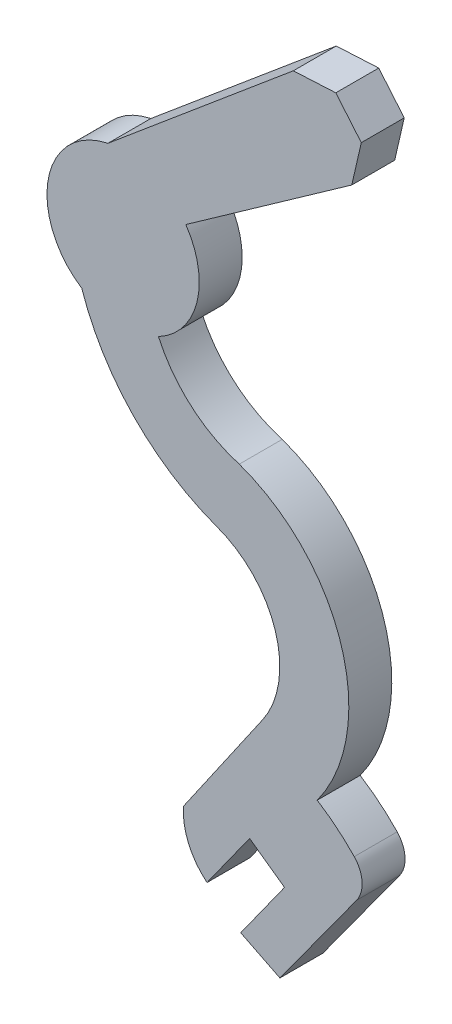
ISO-10303-21;
HEADER;
FILE_DESCRIPTION(('STEP AP214'),'2;1');
FILE_NAME('part.step','',(''),(''),'','','');
FILE_SCHEMA(('AUTOMOTIVE_DESIGN { 1 0 10303 214 1 1 1 1 }'));
ENDSEC;
DATA;
#1=APPLICATION_CONTEXT('core data for automotive mechanical design processes');
#2=APPLICATION_PROTOCOL_DEFINITION('international standard','automotive_design',2000,#1);
#3=PRODUCT_CONTEXT('',#1,'mechanical');
#4=PRODUCT('Part','Part','',(#3));
#5=PRODUCT_RELATED_PRODUCT_CATEGORY('part','',(#4));
#6=PRODUCT_DEFINITION_FORMATION('','',#4);
#7=PRODUCT_DEFINITION_CONTEXT('part definition',#1,'design');
#8=PRODUCT_DEFINITION('design','',#6,#7);
#9=PRODUCT_DEFINITION_SHAPE('','',#8);
#10=(LENGTH_UNIT() NAMED_UNIT(*) SI_UNIT(.MILLI.,.METRE.));
#11=(NAMED_UNIT(*) PLANE_ANGLE_UNIT() SI_UNIT($,.RADIAN.));
#12=(NAMED_UNIT(*) SI_UNIT($,.STERADIAN.) SOLID_ANGLE_UNIT());
#13=UNCERTAINTY_MEASURE_WITH_UNIT(LENGTH_MEASURE(1.E-05),#10,'distance_accuracy_value','');
#14=(GEOMETRIC_REPRESENTATION_CONTEXT(3) GLOBAL_UNCERTAINTY_ASSIGNED_CONTEXT((#13)) GLOBAL_UNIT_ASSIGNED_CONTEXT((#10,
#11,#12)) REPRESENTATION_CONTEXT('',''));
#15=CARTESIAN_POINT('',(0.,0.,0.));
#16=DIRECTION('',(0.,0.,1.));
#17=DIRECTION('',(1.,0.,0.));
#18=AXIS2_PLACEMENT_3D('',#15,#16,#17);
#19=CARTESIAN_POINT('',(1206.55573623688,92.3986337526986,3.));
#20=DIRECTION('',(0.,0.,-1.));
#21=DIRECTION('',(-1.,0.,0.));
#22=AXIS2_PLACEMENT_3D('',#19,#20,#21);
#23=CYLINDRICAL_SURFACE('',#22,15.6739729698047);
#24=CARTESIAN_POINT('',(1206.55573623688,92.3986337526986,0.));
#25=DIRECTION('',(0.,0.,1.));
#26=DIRECTION('',(1.,0.,0.));
#27=AXIS2_PLACEMENT_3D('',#24,#25,#26);
#28=CIRCLE('',#27,15.6739729698047);
#29=CARTESIAN_POINT('',(1191.70051029483,87.3990646843835,0.));
#30=VERTEX_POINT('',#29);
#31=CARTESIAN_POINT('',(1201.09509866461,77.7066336859123,0.));
#32=VERTEX_POINT('',#31);
#33=EDGE_CURVE('E172',#30,#32,#28,.T.);
#34=ORIENTED_EDGE('',*,*,#33,.T.);
#35=DIRECTION('',(0.,0.,-1.));
#36=VECTOR('',#35,1.);
#37=CARTESIAN_POINT('',(1201.09509866461,77.7066336859123,3.));
#38=LINE('',#37,#36);
#39=CARTESIAN_POINT('',(1201.09509866461,77.7066336859123,3.));
#40=VERTEX_POINT('',#39);
#41=EDGE_CURVE('E11',#40,#32,#38,.T.);
#42=ORIENTED_EDGE('',*,*,#41,.F.);
#43=CARTESIAN_POINT('',(1206.55573623688,92.3986337526986,3.));
#44=DIRECTION('',(0.,0.,1.));
#45=DIRECTION('',(1.,0.,0.));
#46=AXIS2_PLACEMENT_3D('',#43,#44,#45);
#47=CIRCLE('',#46,15.6739729698047);
#48=CARTESIAN_POINT('',(1191.70051029483,87.3990646843835,3.));
#49=VERTEX_POINT('',#48);
#50=EDGE_CURVE('E223',#49,#40,#47,.T.);
#51=ORIENTED_EDGE('',*,*,#50,.F.);
#52=DIRECTION('',(0.,0.,-1.));
#53=VECTOR('',#52,1.);
#54=CARTESIAN_POINT('',(1191.70051029483,87.3990646843835,3.));
#55=LINE('',#54,#53);
#56=EDGE_CURVE('E185',#49,#30,#55,.T.);
#57=ORIENTED_EDGE('',*,*,#56,.T.);
#58=EDGE_LOOP('',(#34,#42,#51,#57));
#59=FACE_BOUND('',#58,.T.);
#60=ADVANCED_FACE('F32',(#59),#23,.T.);
#61=CARTESIAN_POINT('',(1198.86864467499,71.4197654436848,3.));
#62=DIRECTION('',(0.,0.,-1.));
#63=DIRECTION('',(-1.,0.,0.));
#64=AXIS2_PLACEMENT_3D('',#61,#62,#63);
#65=CYLINDRICAL_SURFACE('',#64,6.66946846930205);
#66=CARTESIAN_POINT('',(1198.86864467499,71.4197654436848,0.));
#67=DIRECTION('',(0.,0.,-1.));
#68=DIRECTION('',(1.,0.,0.));
#69=AXIS2_PLACEMENT_3D('',#66,#67,#68);
#70=CIRCLE('',#69,6.66946846930205);
#71=CARTESIAN_POINT('',(1204.31947179346,67.5765515038179,0.));
#72=VERTEX_POINT('',#71);
#73=EDGE_CURVE('E168',#32,#72,#70,.T.);
#74=ORIENTED_EDGE('',*,*,#73,.T.);
#75=DIRECTION('',(0.,0.,-1.));
#76=VECTOR('',#75,1.);
#77=CARTESIAN_POINT('',(1204.31947179346,67.5765515038179,3.));
#78=LINE('',#77,#76);
#79=CARTESIAN_POINT('',(1204.31947179346,67.5765515038179,3.));
#80=VERTEX_POINT('',#79);
#81=EDGE_CURVE('E39',#80,#72,#78,.T.);
#82=ORIENTED_EDGE('',*,*,#81,.F.);
#83=CARTESIAN_POINT('',(1198.86864467499,71.4197654436848,3.));
#84=DIRECTION('',(0.,0.,-1.));
#85=DIRECTION('',(1.,0.,0.));
#86=AXIS2_PLACEMENT_3D('',#83,#84,#85);
#87=CIRCLE('',#86,6.66946846930205);
#88=EDGE_CURVE('E181',#40,#80,#87,.T.);
#89=ORIENTED_EDGE('',*,*,#88,.F.);
#90=ORIENTED_EDGE('',*,*,#41,.T.);
#91=EDGE_LOOP('',(#74,#82,#89,#90));
#92=FACE_BOUND('',#91,.T.);
#93=ADVANCED_FACE('F180',(#92),#65,.F.);
#94=CARTESIAN_POINT('',(1204.31947179346,67.5765515038179,3.));
#95=DIRECTION('',(0.822546105775539,-0.568698429638676,0.));
#96=DIRECTION('',(0.568698429638676,0.822546105775539,0.));
#97=AXIS2_PLACEMENT_3D('',#94,#95,#96);
#98=PLANE('',#97);
#99=DIRECTION('',(-0.568698429638676,-0.822546105775539,0.));
#100=VECTOR('',#99,1.);
#101=CARTESIAN_POINT('',(1204.31947179346,67.5765515038179,0.));
#102=LINE('',#101,#100);
#103=CARTESIAN_POINT('',(1198.80528386958,59.6010172541813,0.));
#104=VERTEX_POINT('',#103);
#105=EDGE_CURVE('E174',#72,#104,#102,.T.);
#106=ORIENTED_EDGE('',*,*,#105,.T.);
#107=DIRECTION('',(0.,0.,-1.));
#108=VECTOR('',#107,1.);
#109=CARTESIAN_POINT('',(1198.80528386958,59.6010172541813,3.));
#110=LINE('',#109,#108);
#111=CARTESIAN_POINT('',(1198.80528386958,59.6010172541813,3.));
#112=VERTEX_POINT('',#111);
#113=EDGE_CURVE('E309',#112,#104,#110,.T.);
#114=ORIENTED_EDGE('',*,*,#113,.F.);
#115=DIRECTION('',(-0.568698429638676,-0.822546105775539,0.));
#116=VECTOR('',#115,1.);
#117=CARTESIAN_POINT('',(1204.31947179346,67.5765515038179,3.));
#118=LINE('',#117,#116);
#119=EDGE_CURVE('E226',#80,#112,#118,.T.);
#120=ORIENTED_EDGE('',*,*,#119,.F.);
#121=ORIENTED_EDGE('',*,*,#81,.T.);
#122=EDGE_LOOP('',(#106,#114,#120,#121));
#123=FACE_BOUND('',#122,.T.);
#124=ADVANCED_FACE('F313',(#123),#98,.F.);
#125=CARTESIAN_POINT('',(1203.33645686675,59.3141621195768,3.));
#126=DIRECTION('',(0.,0.,-1.));
#127=DIRECTION('',(-1.,0.,0.));
#128=AXIS2_PLACEMENT_3D('',#125,#126,#127);
#129=CYLINDRICAL_SURFACE('',#128,4.54024389196326);
#130=CARTESIAN_POINT('',(1203.33645686675,59.3141621195768,0.));
#131=DIRECTION('',(0.,0.,1.));
#132=DIRECTION('',(1.,0.,0.));
#133=AXIS2_PLACEMENT_3D('',#130,#131,#132);
#134=CIRCLE('',#133,4.54024389196326);
#135=CARTESIAN_POINT('',(1200.45159364663,55.8082558459136,0.));
#136=VERTEX_POINT('',#135);
#137=EDGE_CURVE('E189',#104,#136,#134,.T.);
#138=ORIENTED_EDGE('',*,*,#137,.T.);
#139=DIRECTION('',(0.,0.,-1.));
#140=VECTOR('',#139,1.);
#141=CARTESIAN_POINT('',(1200.45159364663,55.8082558459136,3.));
#142=LINE('',#141,#140);
#143=CARTESIAN_POINT('',(1200.45159364663,55.8082558459136,3.));
#144=VERTEX_POINT('',#143);
#145=EDGE_CURVE('E306',#144,#136,#142,.T.);
#146=ORIENTED_EDGE('',*,*,#145,.F.);
#147=CARTESIAN_POINT('',(1203.33645686675,59.3141621195768,3.));
#148=DIRECTION('',(0.,0.,1.));
#149=DIRECTION('',(1.,0.,0.));
#150=AXIS2_PLACEMENT_3D('',#147,#148,#149);
#151=CIRCLE('',#150,4.54024389196326);
#152=EDGE_CURVE('E228',#112,#144,#151,.T.);
#153=ORIENTED_EDGE('',*,*,#152,.F.);
#154=ORIENTED_EDGE('',*,*,#113,.T.);
#155=EDGE_LOOP('',(#138,#146,#153,#154));
#156=FACE_BOUND('',#155,.T.);
#157=ADVANCED_FACE('F321',(#156),#129,.T.);
#158=CARTESIAN_POINT('',(1203.42836201403,59.9683664671316,3.));
#159=DIRECTION('',(-0.813246774578806,0.581918966555627,0.));
#160=DIRECTION('',(-0.581918966555627,-0.813246774578806,0.));
#161=AXIS2_PLACEMENT_3D('',#158,#159,#160);
#162=PLANE('',#161);
#163=DIRECTION('',(0.581918966555627,0.813246774578806,0.));
#164=VECTOR('',#163,1.);
#165=CARTESIAN_POINT('',(1203.42836201403,59.9683664671316,0.));
#166=LINE('',#165,#164);
#167=CARTESIAN_POINT('',(1203.42836201403,59.9683664671316,0.));
#168=VERTEX_POINT('',#167);
#169=EDGE_CURVE('E191',#136,#168,#166,.T.);
#170=ORIENTED_EDGE('',*,*,#169,.T.);
#171=DIRECTION('',(0.,0.,-1.));
#172=VECTOR('',#171,1.);
#173=CARTESIAN_POINT('',(1203.42836201403,59.9683664671316,3.));
#174=LINE('',#173,#172);
#175=CARTESIAN_POINT('',(1203.42836201403,59.9683664671316,3.));
#176=VERTEX_POINT('',#175);
#177=EDGE_CURVE('E303',#176,#168,#174,.T.);
#178=ORIENTED_EDGE('',*,*,#177,.F.);
#179=DIRECTION('',(0.581918966555627,0.813246774578806,0.));
#180=VECTOR('',#179,1.);
#181=CARTESIAN_POINT('',(1203.42836201403,59.9683664671316,3.));
#182=LINE('',#181,#180);
#183=EDGE_CURVE('E230',#144,#176,#182,.T.);
#184=ORIENTED_EDGE('',*,*,#183,.F.);
#185=ORIENTED_EDGE('',*,*,#145,.T.);
#186=EDGE_LOOP('',(#170,#178,#184,#185));
#187=FACE_BOUND('',#186,.T.);
#188=ADVANCED_FACE('F324',(#187),#162,.F.);
#189=CARTESIAN_POINT('',(1205.86810233777,58.2226095674648,3.));
#190=DIRECTION('',(0.581918966555631,0.813246774578803,0.));
#191=DIRECTION('',(-0.813246774578803,0.581918966555631,0.));
#192=AXIS2_PLACEMENT_3D('',#189,#190,#191);
#193=PLANE('',#192);
#194=DIRECTION('',(0.813246774578803,-0.581918966555631,0.));
#195=VECTOR('',#194,1.);
#196=CARTESIAN_POINT('',(1205.86810233777,58.2226095674648,0.));
#197=LINE('',#196,#195);
#198=CARTESIAN_POINT('',(1205.86810233777,58.2226095674648,0.));
#199=VERTEX_POINT('',#198);
#200=EDGE_CURVE('E193',#168,#199,#197,.T.);
#201=ORIENTED_EDGE('',*,*,#200,.T.);
#202=DIRECTION('',(0.,0.,-1.));
#203=VECTOR('',#202,1.);
#204=CARTESIAN_POINT('',(1205.86810233777,58.2226095674648,3.));
#205=LINE('',#204,#203);
#206=CARTESIAN_POINT('',(1205.86810233777,58.2226095674648,3.));
#207=VERTEX_POINT('',#206);
#208=EDGE_CURVE('E300',#207,#199,#205,.T.);
#209=ORIENTED_EDGE('',*,*,#208,.F.);
#210=DIRECTION('',(0.813246774578803,-0.581918966555631,0.));
#211=VECTOR('',#210,1.);
#212=CARTESIAN_POINT('',(1205.86810233777,58.2226095674648,3.));
#213=LINE('',#212,#211);
#214=EDGE_CURVE('E232',#176,#207,#213,.T.);
#215=ORIENTED_EDGE('',*,*,#214,.F.);
#216=ORIENTED_EDGE('',*,*,#177,.T.);
#217=EDGE_LOOP('',(#201,#209,#215,#216));
#218=FACE_BOUND('',#217,.T.);
#219=ADVANCED_FACE('F329',(#218),#193,.F.);
#220=CARTESIAN_POINT('',(1202.80900581839,53.947443229044,3.));
#221=DIRECTION('',(0.813246774578807,-0.581918966555626,0.));
#222=DIRECTION('',(0.581918966555626,0.813246774578807,0.));
#223=AXIS2_PLACEMENT_3D('',#220,#221,#222);
#224=PLANE('',#223);
#225=DIRECTION('',(-0.581918966555626,-0.813246774578807,0.));
#226=VECTOR('',#225,1.);
#227=CARTESIAN_POINT('',(1202.80900581839,53.947443229044,0.));
#228=LINE('',#227,#226);
#229=CARTESIAN_POINT('',(1202.80900581839,53.947443229044,0.));
#230=VERTEX_POINT('',#229);
#231=EDGE_CURVE('E195',#199,#230,#228,.T.);
#232=ORIENTED_EDGE('',*,*,#231,.T.);
#233=DIRECTION('',(0.,0.,-1.));
#234=VECTOR('',#233,1.);
#235=CARTESIAN_POINT('',(1202.80900581839,53.947443229044,3.));
#236=LINE('',#235,#234);
#237=CARTESIAN_POINT('',(1202.80900581839,53.947443229044,3.));
#238=VERTEX_POINT('',#237);
#239=EDGE_CURVE('E297',#238,#230,#236,.T.);
#240=ORIENTED_EDGE('',*,*,#239,.F.);
#241=DIRECTION('',(-0.581918966555626,-0.813246774578807,0.));
#242=VECTOR('',#241,1.);
#243=CARTESIAN_POINT('',(1202.80900581839,53.947443229044,3.));
#244=LINE('',#243,#242);
#245=EDGE_CURVE('E234',#207,#238,#244,.T.);
#246=ORIENTED_EDGE('',*,*,#245,.F.);
#247=ORIENTED_EDGE('',*,*,#208,.T.);
#248=EDGE_LOOP('',(#232,#240,#246,#247));
#249=FACE_BOUND('',#248,.T.);
#250=ADVANCED_FACE('F335',(#249),#224,.F.);
#251=CARTESIAN_POINT('',(1202.80900581839,53.947443229044,3.));
#252=DIRECTION('',(0.446610877366972,0.894728296309837,0.));
#253=DIRECTION('',(-0.894728296309837,0.446610877366972,0.));
#254=AXIS2_PLACEMENT_3D('',#251,#252,#253);
#255=PLANE('',#254);
#256=DIRECTION('',(0.894728296309837,-0.446610877366971,0.));
#257=VECTOR('',#256,1.);
#258=CARTESIAN_POINT('',(1202.80900581839,53.947443229044,0.));
#259=LINE('',#258,#257);
#260=CARTESIAN_POINT('',(1205.54736478168,52.580569168858,0.));
#261=VERTEX_POINT('',#260);
#262=EDGE_CURVE('E197',#230,#261,#259,.T.);
#263=ORIENTED_EDGE('',*,*,#262,.T.);
#264=DIRECTION('',(0.,0.,-1.));
#265=VECTOR('',#264,1.);
#266=CARTESIAN_POINT('',(1205.54736478168,52.580569168858,3.));
#267=LINE('',#266,#265);
#268=CARTESIAN_POINT('',(1205.54736478168,52.580569168858,3.));
#269=VERTEX_POINT('',#268);
#270=EDGE_CURVE('E294',#269,#261,#267,.T.);
#271=ORIENTED_EDGE('',*,*,#270,.F.);
#272=DIRECTION('',(0.894728296309837,-0.446610877366971,0.));
#273=VECTOR('',#272,1.);
#274=CARTESIAN_POINT('',(1202.80900581839,53.947443229044,3.));
#275=LINE('',#274,#273);
#276=EDGE_CURVE('E236',#238,#269,#275,.T.);
#277=ORIENTED_EDGE('',*,*,#276,.F.);
#278=ORIENTED_EDGE('',*,*,#239,.T.);
#279=EDGE_LOOP('',(#263,#271,#277,#278));
#280=FACE_BOUND('',#279,.T.);
#281=ADVANCED_FACE('F339',(#280),#255,.F.);
#282=CARTESIAN_POINT('',(1205.54736478168,52.580569168858,3.));
#283=DIRECTION('',(-0.80927221562022,0.587433809909797,0.));
#284=DIRECTION('',(-0.587433809909797,-0.80927221562022,0.));
#285=AXIS2_PLACEMENT_3D('',#282,#283,#284);
#286=PLANE('',#285);
#287=DIRECTION('',(0.587433809909797,0.80927221562022,0.));
#288=VECTOR('',#287,1.);
#289=CARTESIAN_POINT('',(1205.54736478168,52.580569168858,0.));
#290=LINE('',#289,#288);
#291=CARTESIAN_POINT('',(1210.91126424405,59.9700907269451,0.));
#292=VERTEX_POINT('',#291);
#293=EDGE_CURVE('E199',#261,#292,#290,.T.);
#294=ORIENTED_EDGE('',*,*,#293,.T.);
#295=DIRECTION('',(0.,0.,-1.));
#296=VECTOR('',#295,1.);
#297=CARTESIAN_POINT('',(1210.91126424405,59.9700907269451,3.));
#298=LINE('',#297,#296);
#299=CARTESIAN_POINT('',(1210.91126424405,59.9700907269451,3.));
#300=VERTEX_POINT('',#299);
#301=EDGE_CURVE('E291',#300,#292,#298,.T.);
#302=ORIENTED_EDGE('',*,*,#301,.F.);
#303=DIRECTION('',(0.587433809909797,0.80927221562022,0.));
#304=VECTOR('',#303,1.);
#305=CARTESIAN_POINT('',(1205.54736478168,52.580569168858,3.));
#306=LINE('',#305,#304);
#307=EDGE_CURVE('E238',#269,#300,#306,.T.);
#308=ORIENTED_EDGE('',*,*,#307,.F.);
#309=ORIENTED_EDGE('',*,*,#270,.T.);
#310=EDGE_LOOP('',(#294,#302,#308,#309));
#311=FACE_BOUND('',#310,.T.);
#312=ADVANCED_FACE('F344',(#311),#286,.F.);
#313=CARTESIAN_POINT('',(1209.29271981281,61.1449583467646,3.));
#314=DIRECTION('',(0.,0.,-1.));
#315=DIRECTION('',(-1.,0.,0.));
#316=AXIS2_PLACEMENT_3D('',#313,#314,#315);
#317=CYLINDRICAL_SURFACE('',#316,2.00000000000018);
#318=CARTESIAN_POINT('',(1209.29271981281,61.1449583467646,0.));
#319=DIRECTION('',(0.,0.,1.));
#320=DIRECTION('',(1.,0.,0.));
#321=AXIS2_PLACEMENT_3D('',#318,#319,#320);
#322=CIRCLE('',#321,2.00000000000018);
#323=CARTESIAN_POINT('',(1210.74178640719,62.5234379458369,0.));
#324=VERTEX_POINT('',#323);
#325=EDGE_CURVE('E201',#292,#324,#322,.T.);
#326=ORIENTED_EDGE('',*,*,#325,.T.);
#327=DIRECTION('',(0.,0.,-1.));
#328=VECTOR('',#327,1.);
#329=CARTESIAN_POINT('',(1210.74178640719,62.5234379458369,3.));
#330=LINE('',#329,#328);
#331=CARTESIAN_POINT('',(1210.74178640719,62.5234379458369,3.));
#332=VERTEX_POINT('',#331);
#333=EDGE_CURVE('E288',#332,#324,#330,.T.);
#334=ORIENTED_EDGE('',*,*,#333,.F.);
#335=CARTESIAN_POINT('',(1209.29271981281,61.1449583467646,3.));
#336=DIRECTION('',(0.,0.,1.));
#337=DIRECTION('',(1.,0.,0.));
#338=AXIS2_PLACEMENT_3D('',#335,#336,#337);
#339=CIRCLE('',#338,2.00000000000018);
#340=EDGE_CURVE('E240',#300,#332,#339,.T.);
#341=ORIENTED_EDGE('',*,*,#340,.F.);
#342=ORIENTED_EDGE('',*,*,#301,.T.);
#343=EDGE_LOOP('',(#326,#334,#341,#342));
#344=FACE_BOUND('',#343,.T.);
#345=ADVANCED_FACE('F350',(#344),#317,.T.);
#346=CARTESIAN_POINT('',(1200.97144191068,53.2290268976515,3.));
#347=DIRECTION('',(0.,0.,-1.));
#348=DIRECTION('',(-1.,0.,0.));
#349=AXIS2_PLACEMENT_3D('',#346,#347,#348);
#350=CYLINDRICAL_SURFACE('',#349,13.4850179203867);
#351=CARTESIAN_POINT('',(1200.97144191068,53.2290268976515,0.));
#352=DIRECTION('',(0.,0.,1.));
#353=DIRECTION('',(1.,0.,0.));
#354=AXIS2_PLACEMENT_3D('',#351,#352,#353);
#355=CIRCLE('',#354,13.4850179203867);
#356=CARTESIAN_POINT('',(1208.1531542027,64.642559079573,0.));
#357=VERTEX_POINT('',#356);
#358=EDGE_CURVE('E203',#324,#357,#355,.T.);
#359=ORIENTED_EDGE('',*,*,#358,.T.);
#360=DIRECTION('',(0.,0.,-1.));
#361=VECTOR('',#360,1.);
#362=CARTESIAN_POINT('',(1208.1531542027,64.642559079573,3.));
#363=LINE('',#362,#361);
#364=CARTESIAN_POINT('',(1208.1531542027,64.642559079573,3.));
#365=VERTEX_POINT('',#364);
#366=EDGE_CURVE('E285',#365,#357,#363,.T.);
#367=ORIENTED_EDGE('',*,*,#366,.F.);
#368=CARTESIAN_POINT('',(1200.97144191068,53.2290268976515,3.));
#369=DIRECTION('',(0.,0.,1.));
#370=DIRECTION('',(1.,0.,0.));
#371=AXIS2_PLACEMENT_3D('',#368,#369,#370);
#372=CIRCLE('',#371,13.4850179203867);
#373=EDGE_CURVE('E242',#332,#365,#372,.T.);
#374=ORIENTED_EDGE('',*,*,#373,.F.);
#375=ORIENTED_EDGE('',*,*,#333,.T.);
#376=EDGE_LOOP('',(#359,#367,#374,#375));
#377=FACE_BOUND('',#376,.T.);
#378=ADVANCED_FACE('F354',(#377),#350,.T.);
#379=CARTESIAN_POINT('',(1198.86864467499,71.4197654436848,3.));
#380=DIRECTION('',(0.,0.,-1.));
#381=DIRECTION('',(-1.,0.,0.));
#382=AXIS2_PLACEMENT_3D('',#379,#380,#381);
#383=CYLINDRICAL_SURFACE('',#382,11.4948964010969);
#384=CARTESIAN_POINT('',(1198.86864467499,71.4197654436848,0.));
#385=DIRECTION('',(0.,0.,1.));
#386=DIRECTION('',(1.,0.,0.));
#387=AXIS2_PLACEMENT_3D('',#384,#385,#386);
#388=CIRCLE('',#387,11.4948964010969);
#389=CARTESIAN_POINT('',(1202.70596065755,82.2552464815483,0.));
#390=VERTEX_POINT('',#389);
#391=EDGE_CURVE('E205',#357,#390,#388,.T.);
#392=ORIENTED_EDGE('',*,*,#391,.T.);
#393=DIRECTION('',(0.,0.,-1.));
#394=VECTOR('',#393,1.);
#395=CARTESIAN_POINT('',(1202.70596065755,82.2552464815483,3.));
#396=LINE('',#395,#394);
#397=CARTESIAN_POINT('',(1202.70596065755,82.2552464815483,3.));
#398=VERTEX_POINT('',#397);
#399=EDGE_CURVE('E282',#398,#390,#396,.T.);
#400=ORIENTED_EDGE('',*,*,#399,.F.);
#401=CARTESIAN_POINT('',(1198.86864467499,71.4197654436848,3.));
#402=DIRECTION('',(0.,0.,1.));
#403=DIRECTION('',(1.,0.,0.));
#404=AXIS2_PLACEMENT_3D('',#401,#402,#403);
#405=CIRCLE('',#404,11.4948964010969);
#406=EDGE_CURVE('E244',#365,#398,#405,.T.);
#407=ORIENTED_EDGE('',*,*,#406,.F.);
#408=ORIENTED_EDGE('',*,*,#366,.T.);
#409=EDGE_LOOP('',(#392,#400,#407,#408));
#410=FACE_BOUND('',#409,.T.);
#411=ADVANCED_FACE('F359',(#410),#383,.T.);
#412=CARTESIAN_POINT('',(1205.20486522045,90.8399015009431,3.));
#413=DIRECTION('',(0.,0.,-1.));
#414=DIRECTION('',(-1.,0.,0.));
#415=AXIS2_PLACEMENT_3D('',#412,#413,#414);
#416=CYLINDRICAL_SURFACE('',#415,8.94096336065019);
#417=CARTESIAN_POINT('',(1205.20486522045,90.8399015009431,0.));
#418=DIRECTION('',(0.,0.,-1.));
#419=DIRECTION('',(1.,0.,0.));
#420=AXIS2_PLACEMENT_3D('',#417,#418,#419);
#421=CIRCLE('',#420,8.94096336065019);
#422=CARTESIAN_POINT('',(1197.05898600783,87.1540532037529,0.));
#423=VERTEX_POINT('',#422);
#424=EDGE_CURVE('E207',#390,#423,#421,.T.);
#425=ORIENTED_EDGE('',*,*,#424,.T.);
#426=DIRECTION('',(0.,0.,-1.));
#427=VECTOR('',#426,1.);
#428=CARTESIAN_POINT('',(1197.05898600783,87.1540532037529,3.));
#429=LINE('',#428,#427);
#430=CARTESIAN_POINT('',(1197.05898600783,87.1540532037529,3.));
#431=VERTEX_POINT('',#430);
#432=EDGE_CURVE('E279',#431,#423,#429,.T.);
#433=ORIENTED_EDGE('',*,*,#432,.F.);
#434=CARTESIAN_POINT('',(1205.20486522045,90.8399015009431,3.));
#435=DIRECTION('',(0.,0.,-1.));
#436=DIRECTION('',(1.,0.,0.));
#437=AXIS2_PLACEMENT_3D('',#434,#435,#436);
#438=CIRCLE('',#437,8.94096336065019);
#439=EDGE_CURVE('E246',#398,#431,#438,.T.);
#440=ORIENTED_EDGE('',*,*,#439,.F.);
#441=ORIENTED_EDGE('',*,*,#399,.T.);
#442=EDGE_LOOP('',(#425,#433,#440,#441));
#443=FACE_BOUND('',#442,.T.);
#444=ADVANCED_FACE('F365',(#443),#416,.F.);
#445=CARTESIAN_POINT('',(1194.58964197128,91.8670007209883,3.));
#446=DIRECTION('',(0.,0.,-1.));
#447=DIRECTION('',(-1.,0.,0.));
#448=AXIS2_PLACEMENT_3D('',#445,#446,#447);
#449=CYLINDRICAL_SURFACE('',#448,5.32067047194809);
#450=CARTESIAN_POINT('',(1194.58964197128,91.8670007209883,0.));
#451=DIRECTION('',(0.,0.,1.));
#452=DIRECTION('',(1.,0.,0.));
#453=AXIS2_PLACEMENT_3D('',#450,#451,#452);
#454=CIRCLE('',#453,5.32067047194809);
#455=CARTESIAN_POINT('',(1198.96978772581,94.8875730906088,0.));
#456=VERTEX_POINT('',#455);
#457=EDGE_CURVE('E209',#423,#456,#454,.T.);
#458=ORIENTED_EDGE('',*,*,#457,.T.);
#459=DIRECTION('',(0.,0.,-1.));
#460=VECTOR('',#459,1.);
#461=CARTESIAN_POINT('',(1198.96978772581,94.8875730906088,3.));
#462=LINE('',#461,#460);
#463=CARTESIAN_POINT('',(1198.96978772581,94.8875730906088,3.));
#464=VERTEX_POINT('',#463);
#465=EDGE_CURVE('E276',#464,#456,#462,.T.);
#466=ORIENTED_EDGE('',*,*,#465,.F.);
#467=CARTESIAN_POINT('',(1194.58964197128,91.8670007209883,3.));
#468=DIRECTION('',(0.,0.,1.));
#469=DIRECTION('',(1.,0.,0.));
#470=AXIS2_PLACEMENT_3D('',#467,#468,#469);
#471=CIRCLE('',#470,5.32067047194809);
#472=EDGE_CURVE('E248',#431,#464,#471,.T.);
#473=ORIENTED_EDGE('',*,*,#472,.F.);
#474=ORIENTED_EDGE('',*,*,#432,.T.);
#475=EDGE_LOOP('',(#458,#466,#473,#474));
#476=FACE_BOUND('',#475,.T.);
#477=ADVANCED_FACE('F369',(#476),#449,.T.);
#478=CARTESIAN_POINT('',(1198.96978772581,94.8875730906088,3.));
#479=DIRECTION('',(-0.576841086612473,0.816856389333977,0.));
#480=DIRECTION('',(-0.816856389333977,-0.576841086612473,0.));
#481=AXIS2_PLACEMENT_3D('',#478,#479,#480);
#482=PLANE('',#481);
#483=DIRECTION('',(0.816856389333977,0.576841086612473,0.));
#484=VECTOR('',#483,1.);
#485=CARTESIAN_POINT('',(1198.96978772581,94.8875730906088,0.));
#486=LINE('',#485,#484);
#487=CARTESIAN_POINT('',(1210.56860500785,103.078332753812,0.));
#488=VERTEX_POINT('',#487);
#489=EDGE_CURVE('E211',#456,#488,#486,.T.);
#490=ORIENTED_EDGE('',*,*,#489,.T.);
#491=DIRECTION('',(0.,0.,-1.));
#492=VECTOR('',#491,1.);
#493=CARTESIAN_POINT('',(1210.56860500785,103.078332753812,3.));
#494=LINE('',#493,#492);
#495=CARTESIAN_POINT('',(1210.56860500785,103.078332753812,3.));
#496=VERTEX_POINT('',#495);
#497=EDGE_CURVE('E273',#496,#488,#494,.T.);
#498=ORIENTED_EDGE('',*,*,#497,.F.);
#499=DIRECTION('',(0.816856389333977,0.576841086612473,0.));
#500=VECTOR('',#499,1.);
#501=CARTESIAN_POINT('',(1198.96978772581,94.8875730906088,3.));
#502=LINE('',#501,#500);
#503=EDGE_CURVE('E250',#464,#496,#502,.T.);
#504=ORIENTED_EDGE('',*,*,#503,.F.);
#505=ORIENTED_EDGE('',*,*,#465,.T.);
#506=EDGE_LOOP('',(#490,#498,#504,#505));
#507=FACE_BOUND('',#506,.T.);
#508=ADVANCED_FACE('F374',(#507),#482,.F.);
#509=CARTESIAN_POINT('',(1210.56860500785,103.078332753812,3.));
#510=DIRECTION('',(-0.974639852757301,0.223779260471623,0.));
#511=DIRECTION('',(-0.223779260471623,-0.974639852757301,0.));
#512=AXIS2_PLACEMENT_3D('',#509,#510,#511);
#513=PLANE('',#512);
#514=DIRECTION('',(0.223779260471623,0.974639852757301,0.));
#515=VECTOR('',#514,1.);
#516=CARTESIAN_POINT('',(1210.56860500785,103.078332753812,0.));
#517=LINE('',#516,#515);
#518=CARTESIAN_POINT('',(1211.23355926715,105.974449757741,0.));
#519=VERTEX_POINT('',#518);
#520=EDGE_CURVE('E213',#488,#519,#517,.T.);
#521=ORIENTED_EDGE('',*,*,#520,.T.);
#522=DIRECTION('',(0.,0.,-1.));
#523=VECTOR('',#522,1.);
#524=CARTESIAN_POINT('',(1211.23355926715,105.974449757741,3.));
#525=LINE('',#524,#523);
#526=CARTESIAN_POINT('',(1211.23355926715,105.974449757741,3.));
#527=VERTEX_POINT('',#526);
#528=EDGE_CURVE('E270',#527,#519,#525,.T.);
#529=ORIENTED_EDGE('',*,*,#528,.F.);
#530=DIRECTION('',(0.223779260471623,0.974639852757301,0.));
#531=VECTOR('',#530,1.);
#532=CARTESIAN_POINT('',(1210.56860500785,103.078332753812,3.));
#533=LINE('',#532,#531);
#534=EDGE_CURVE('E252',#496,#527,#533,.T.);
#535=ORIENTED_EDGE('',*,*,#534,.F.);
#536=ORIENTED_EDGE('',*,*,#497,.T.);
#537=EDGE_LOOP('',(#521,#529,#535,#536));
#538=FACE_BOUND('',#537,.T.);
#539=ADVANCED_FACE('F380',(#538),#513,.F.);
#540=CARTESIAN_POINT('',(1209.45182050112,108.098879879984,3.));
#541=DIRECTION('',(-0.766198883464896,-0.642603509932172,0.));
#542=DIRECTION('',(0.642603509932172,-0.766198883464896,0.));
#543=AXIS2_PLACEMENT_3D('',#540,#541,#542);
#544=PLANE('',#543);
#545=DIRECTION('',(-0.642603509932172,0.766198883464896,0.));
#546=VECTOR('',#545,1.);
#547=CARTESIAN_POINT('',(1209.45182050112,108.098879879984,0.));
#548=LINE('',#547,#546);
#549=CARTESIAN_POINT('',(1209.45182050112,108.098879879984,0.));
#550=VERTEX_POINT('',#549);
#551=EDGE_CURVE('E215',#519,#550,#548,.T.);
#552=ORIENTED_EDGE('',*,*,#551,.T.);
#553=DIRECTION('',(0.,0.,-1.));
#554=VECTOR('',#553,1.);
#555=CARTESIAN_POINT('',(1209.45182050112,108.098879879984,3.));
#556=LINE('',#555,#554);
#557=CARTESIAN_POINT('',(1209.45182050112,108.098879879984,3.));
#558=VERTEX_POINT('',#557);
#559=EDGE_CURVE('E267',#558,#550,#556,.T.);
#560=ORIENTED_EDGE('',*,*,#559,.F.);
#561=DIRECTION('',(-0.642603509932172,0.766198883464896,0.));
#562=VECTOR('',#561,1.);
#563=CARTESIAN_POINT('',(1209.45182050112,108.098879879984,3.));
#564=LINE('',#563,#562);
#565=EDGE_CURVE('E254',#527,#558,#564,.T.);
#566=ORIENTED_EDGE('',*,*,#565,.F.);
#567=ORIENTED_EDGE('',*,*,#528,.T.);
#568=EDGE_LOOP('',(#552,#560,#566,#567));
#569=FACE_BOUND('',#568,.T.);
#570=ADVANCED_FACE('F384',(#569),#544,.F.);
#571=CARTESIAN_POINT('',(1206.48416124353,107.948359455226,3.));
#572=DIRECTION('',(0.0506551373527283,-0.9987162044644,0.));
#573=DIRECTION('',(0.9987162044644,0.0506551373527283,0.));
#574=AXIS2_PLACEMENT_3D('',#571,#572,#573);
#575=PLANE('',#574);
#576=DIRECTION('',(-0.998716204464399,-0.0506551373527283,0.));
#577=VECTOR('',#576,1.);
#578=CARTESIAN_POINT('',(1206.48416124353,107.948359455226,0.));
#579=LINE('',#578,#577);
#580=CARTESIAN_POINT('',(1206.48416124353,107.948359455226,0.));
#581=VERTEX_POINT('',#580);
#582=EDGE_CURVE('E217',#550,#581,#579,.T.);
#583=ORIENTED_EDGE('',*,*,#582,.T.);
#584=DIRECTION('',(0.,0.,-1.));
#585=VECTOR('',#584,1.);
#586=CARTESIAN_POINT('',(1206.48416124353,107.948359455226,3.));
#587=LINE('',#586,#585);
#588=CARTESIAN_POINT('',(1206.48416124353,107.948359455226,3.));
#589=VERTEX_POINT('',#588);
#590=EDGE_CURVE('E264',#589,#581,#587,.T.);
#591=ORIENTED_EDGE('',*,*,#590,.F.);
#592=DIRECTION('',(-0.998716204464399,-0.0506551373527283,0.));
#593=VECTOR('',#592,1.);
#594=CARTESIAN_POINT('',(1206.48416124353,107.948359455226,3.));
#595=LINE('',#594,#593);
#596=EDGE_CURVE('E256',#558,#589,#595,.T.);
#597=ORIENTED_EDGE('',*,*,#596,.F.);
#598=ORIENTED_EDGE('',*,*,#559,.T.);
#599=EDGE_LOOP('',(#583,#591,#597,#598));
#600=FACE_BOUND('',#599,.T.);
#601=ADVANCED_FACE('F389',(#600),#575,.F.);
#602=CARTESIAN_POINT('',(1193.52567838818,97.0802066218601,3.));
#603=DIRECTION('',(0.642603509932309,-0.76619888346478,0.));
#604=DIRECTION('',(0.766198883464781,0.642603509932309,0.));
#605=AXIS2_PLACEMENT_3D('',#602,#603,#604);
#606=PLANE('',#605);
#607=DIRECTION('',(-0.76619888346478,-0.642603509932309,0.));
#608=VECTOR('',#607,1.);
#609=CARTESIAN_POINT('',(1193.52567838818,97.0802066218601,0.));
#610=LINE('',#609,#608);
#611=CARTESIAN_POINT('',(1193.52567838818,97.0802066218601,0.));
#612=VERTEX_POINT('',#611);
#613=EDGE_CURVE('E219',#581,#612,#610,.T.);
#614=ORIENTED_EDGE('',*,*,#613,.T.);
#615=DIRECTION('',(0.,0.,-1.));
#616=VECTOR('',#615,1.);
#617=CARTESIAN_POINT('',(1193.52567838818,97.0802066218601,3.));
#618=LINE('',#617,#616);
#619=CARTESIAN_POINT('',(1193.52567838818,97.0802066218601,3.));
#620=VERTEX_POINT('',#619);
#621=EDGE_CURVE('E261',#620,#612,#618,.T.);
#622=ORIENTED_EDGE('',*,*,#621,.F.);
#623=DIRECTION('',(-0.76619888346478,-0.642603509932309,0.));
#624=VECTOR('',#623,1.);
#625=CARTESIAN_POINT('',(1193.52567838818,97.0802066218601,3.));
#626=LINE('',#625,#624);
#627=EDGE_CURVE('E51',#589,#620,#626,.T.);
#628=ORIENTED_EDGE('',*,*,#627,.F.);
#629=ORIENTED_EDGE('',*,*,#590,.T.);
#630=EDGE_LOOP('',(#614,#622,#628,#629));
#631=FACE_BOUND('',#630,.T.);
#632=ADVANCED_FACE('F392',(#631),#606,.F.);
#633=CARTESIAN_POINT('',(1194.58964197128,91.8670007209883,3.));
#634=DIRECTION('',(0.,0.,-1.));
#635=DIRECTION('',(-1.,0.,0.));
#636=AXIS2_PLACEMENT_3D('',#633,#634,#635);
#637=CYLINDRICAL_SURFACE('',#636,5.3206704719481);
#638=CARTESIAN_POINT('',(1194.58964197128,91.8670007209883,0.));
#639=DIRECTION('',(0.,0.,1.));
#640=DIRECTION('',(1.,0.,0.));
#641=AXIS2_PLACEMENT_3D('',#638,#639,#640);
#642=CIRCLE('',#641,5.3206704719481);
#643=EDGE_CURVE('E221',#612,#30,#642,.T.);
#644=ORIENTED_EDGE('',*,*,#643,.T.);
#645=ORIENTED_EDGE('',*,*,#56,.F.);
#646=CARTESIAN_POINT('',(1194.58964197128,91.8670007209883,3.));
#647=DIRECTION('',(0.,0.,1.));
#648=DIRECTION('',(1.,0.,0.));
#649=AXIS2_PLACEMENT_3D('',#646,#647,#648);
#650=CIRCLE('',#649,5.3206704719481);
#651=EDGE_CURVE('E46',#620,#49,#650,.T.);
#652=ORIENTED_EDGE('',*,*,#651,.F.);
#653=ORIENTED_EDGE('',*,*,#621,.T.);
#654=EDGE_LOOP('',(#644,#645,#652,#653));
#655=FACE_BOUND('',#654,.T.);
#656=ADVANCED_FACE('F394',(#655),#637,.T.);
#657=CARTESIAN_POINT('',(1206.55573623688,92.3986337526986,3.));
#658=DIRECTION('',(0.,0.,1.));
#659=DIRECTION('',(1.,0.,0.));
#660=AXIS2_PLACEMENT_3D('',#657,#658,#659);
#661=PLANE('',#660);
#662=ORIENTED_EDGE('',*,*,#50,.T.);
#663=ORIENTED_EDGE('',*,*,#88,.T.);
#664=ORIENTED_EDGE('',*,*,#119,.T.);
#665=ORIENTED_EDGE('',*,*,#152,.T.);
#666=ORIENTED_EDGE('',*,*,#183,.T.);
#667=ORIENTED_EDGE('',*,*,#214,.T.);
#668=ORIENTED_EDGE('',*,*,#245,.T.);
#669=ORIENTED_EDGE('',*,*,#276,.T.);
#670=ORIENTED_EDGE('',*,*,#307,.T.);
#671=ORIENTED_EDGE('',*,*,#340,.T.);
#672=ORIENTED_EDGE('',*,*,#373,.T.);
#673=ORIENTED_EDGE('',*,*,#406,.T.);
#674=ORIENTED_EDGE('',*,*,#439,.T.);
#675=ORIENTED_EDGE('',*,*,#472,.T.);
#676=ORIENTED_EDGE('',*,*,#503,.T.);
#677=ORIENTED_EDGE('',*,*,#534,.T.);
#678=ORIENTED_EDGE('',*,*,#565,.T.);
#679=ORIENTED_EDGE('',*,*,#596,.T.);
#680=ORIENTED_EDGE('',*,*,#627,.T.);
#681=ORIENTED_EDGE('',*,*,#651,.T.);
#682=EDGE_LOOP('',(#662,#663,#664,#665,#666,#667,#668,#669,#670,#671,#672,#673,#674,#675,#676,
#677,#678,#679,#680,#681));
#683=FACE_BOUND('',#682,.T.);
#684=ADVANCED_FACE('F316',(#683),#661,.T.);
#685=CARTESIAN_POINT('',(1206.55573623688,92.3986337526986,0.));
#686=DIRECTION('',(0.,0.,1.));
#687=DIRECTION('',(1.,0.,0.));
#688=AXIS2_PLACEMENT_3D('',#685,#686,#687);
#689=PLANE('',#688);
#690=ORIENTED_EDGE('',*,*,#33,.F.);
#691=ORIENTED_EDGE('',*,*,#643,.F.);
#692=ORIENTED_EDGE('',*,*,#613,.F.);
#693=ORIENTED_EDGE('',*,*,#582,.F.);
#694=ORIENTED_EDGE('',*,*,#551,.F.);
#695=ORIENTED_EDGE('',*,*,#520,.F.);
#696=ORIENTED_EDGE('',*,*,#489,.F.);
#697=ORIENTED_EDGE('',*,*,#457,.F.);
#698=ORIENTED_EDGE('',*,*,#424,.F.);
#699=ORIENTED_EDGE('',*,*,#391,.F.);
#700=ORIENTED_EDGE('',*,*,#358,.F.);
#701=ORIENTED_EDGE('',*,*,#325,.F.);
#702=ORIENTED_EDGE('',*,*,#293,.F.);
#703=ORIENTED_EDGE('',*,*,#262,.F.);
#704=ORIENTED_EDGE('',*,*,#231,.F.);
#705=ORIENTED_EDGE('',*,*,#200,.F.);
#706=ORIENTED_EDGE('',*,*,#169,.F.);
#707=ORIENTED_EDGE('',*,*,#137,.F.);
#708=ORIENTED_EDGE('',*,*,#105,.F.);
#709=ORIENTED_EDGE('',*,*,#73,.F.);
#710=EDGE_LOOP('',(#690,#691,#692,#693,#694,#695,#696,#697,#698,#699,#700,#701,#702,#703,#704,
#705,#706,#707,#708,#709));
#711=FACE_BOUND('',#710,.T.);
#712=ADVANCED_FACE('F169',(#711),#689,.F.);
#713=CLOSED_SHELL('',(#60,#93,#124,#157,#188,#219,#250,#281,#312,#345,#378,#411,#444,#477,#508,
#539,#570,#601,#632,#656,#684,#712));
#714=MANIFOLD_SOLID_BREP('B2',#713);
#715=ADVANCED_BREP_SHAPE_REPRESENTATION('',(#18,#714),#14);
#716=SHAPE_DEFINITION_REPRESENTATION(#9,#715);
ENDSEC;
END-ISO-10303-21;
